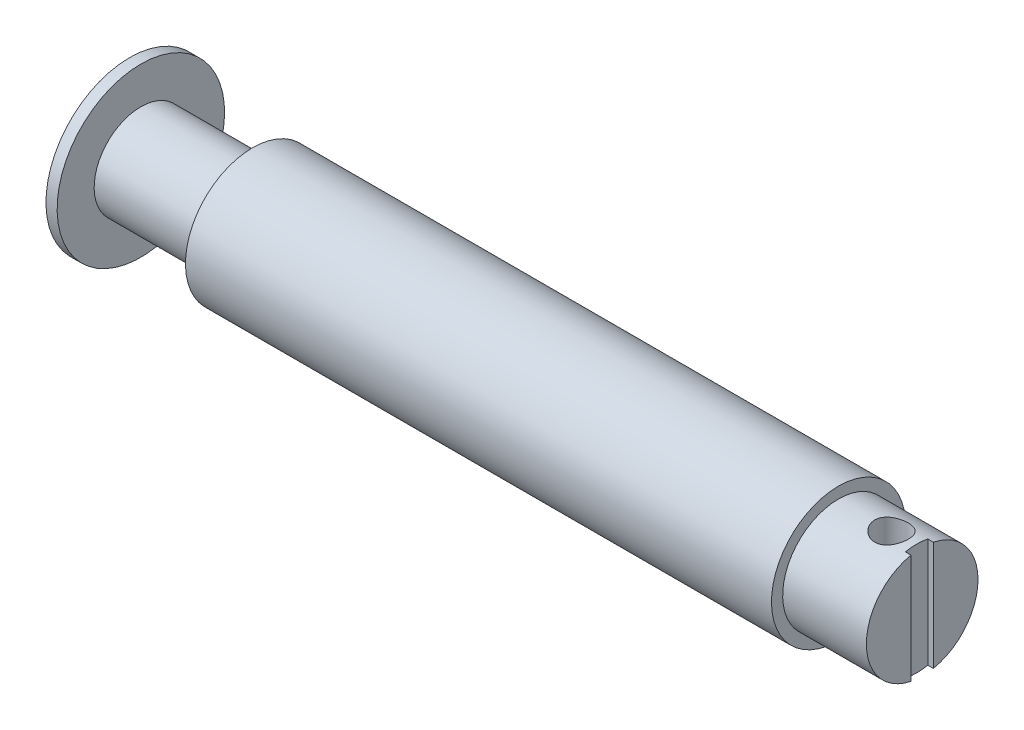
ISO-10303-21;
HEADER;
FILE_DESCRIPTION(('STEP AP214'),'2;1');
FILE_NAME('part.step','',(''),(''),'','','');
FILE_SCHEMA(('AUTOMOTIVE_DESIGN { 1 0 10303 214 1 1 1 1 }'));
ENDSEC;
DATA;
#1=APPLICATION_CONTEXT('core data for automotive mechanical design processes');
#2=APPLICATION_PROTOCOL_DEFINITION('international standard','automotive_design',2000,#1);
#3=PRODUCT_CONTEXT('',#1,'mechanical');
#4=PRODUCT('Part','Part','',(#3));
#5=PRODUCT_RELATED_PRODUCT_CATEGORY('part','',(#4));
#6=PRODUCT_DEFINITION_FORMATION('','',#4);
#7=PRODUCT_DEFINITION_CONTEXT('part definition',#1,'design');
#8=PRODUCT_DEFINITION('design','',#6,#7);
#9=PRODUCT_DEFINITION_SHAPE('','',#8);
#10=(LENGTH_UNIT() NAMED_UNIT(*) SI_UNIT(.MILLI.,.METRE.));
#11=(NAMED_UNIT(*) PLANE_ANGLE_UNIT() SI_UNIT($,.RADIAN.));
#12=(NAMED_UNIT(*) SI_UNIT($,.STERADIAN.) SOLID_ANGLE_UNIT());
#13=UNCERTAINTY_MEASURE_WITH_UNIT(LENGTH_MEASURE(1.E-05),#10,'distance_accuracy_value','');
#14=(GEOMETRIC_REPRESENTATION_CONTEXT(3) GLOBAL_UNCERTAINTY_ASSIGNED_CONTEXT((#13)) GLOBAL_UNIT_ASSIGNED_CONTEXT((#10,
#11,#12)) REPRESENTATION_CONTEXT('',''));
#15=CARTESIAN_POINT('',(0.,0.,0.));
#16=DIRECTION('',(0.,0.,1.));
#17=DIRECTION('',(1.,0.,0.));
#18=AXIS2_PLACEMENT_3D('',#15,#16,#17);
#19=CARTESIAN_POINT('',(87.,2.70021046205131E-13,0.));
#20=DIRECTION('',(1.,0.,0.));
#21=DIRECTION('',(0.,1.,0.));
#22=AXIS2_PLACEMENT_3D('',#19,#20,#21);
#23=PLANE('',#22);
#24=CARTESIAN_POINT('',(87.,2.70021046205131E-13,0.));
#25=DIRECTION('',(1.,0.,0.));
#26=DIRECTION('',(0.,1.,0.));
#27=AXIS2_PLACEMENT_3D('',#24,#25,#26);
#28=CIRCLE('',#27,9.99999999999867);
#29=CARTESIAN_POINT('',(87.,9.79795897113149,-2.));
#30=VERTEX_POINT('',#29);
#31=CARTESIAN_POINT('',(87.,9.79795897113149,2.));
#32=VERTEX_POINT('',#31);
#33=EDGE_CURVE('E103',#30,#32,#28,.T.);
#34=ORIENTED_EDGE('',*,*,#33,.T.);
#35=DIRECTION('',(0.,1.,0.));
#36=VECTOR('',#35,1.);
#37=CARTESIAN_POINT('',(87.,9.79795897113149,2.));
#38=LINE('',#37,#36);
#39=CARTESIAN_POINT('',(87.,-9.79795897113109,2.));
#40=VERTEX_POINT('',#39);
#41=EDGE_CURVE('E87',#40,#32,#38,.T.);
#42=ORIENTED_EDGE('',*,*,#41,.F.);
#43=CARTESIAN_POINT('',(87.,-9.79795897113122,-2.));
#44=VERTEX_POINT('',#43);
#45=EDGE_CURVE('E109',#40,#44,#28,.T.);
#46=ORIENTED_EDGE('',*,*,#45,.T.);
#47=DIRECTION('',(0.,1.,0.));
#48=VECTOR('',#47,1.);
#49=CARTESIAN_POINT('',(87.,-9.79795897113122,-2.));
#50=LINE('',#49,#48);
#51=EDGE_CURVE('E108',#44,#30,#50,.T.);
#52=ORIENTED_EDGE('',*,*,#51,.T.);
#53=EDGE_LOOP('',(#34,#42,#46,#52));
#54=FACE_BOUND('',#53,.T.);
#55=ADVANCED_FACE('F43',(#54),#23,.T.);
#56=CARTESIAN_POINT('',(73.,2.70616862252382E-13,0.));
#57=DIRECTION('',(1.,0.,0.));
#58=DIRECTION('',(0.,1.,0.));
#59=AXIS2_PLACEMENT_3D('',#56,#57,#58);
#60=PLANE('',#59);
#61=CARTESIAN_POINT('',(73.,2.70616862252382E-13,0.));
#62=DIRECTION('',(1.,0.,0.));
#63=DIRECTION('',(0.,1.,0.));
#64=AXIS2_PLACEMENT_3D('',#61,#62,#63);
#65=CIRCLE('',#64,12.);
#66=CARTESIAN_POINT('',(73.,12.0000000000003,0.));
#67=VERTEX_POINT('',#66);
#68=EDGE_CURVE('E138',#67,#67,#65,.T.);
#69=ORIENTED_EDGE('',*,*,#68,.T.);
#70=EDGE_LOOP('',(#69));
#71=FACE_BOUND('',#70,.T.);
#72=CARTESIAN_POINT('',(73.,2.70025701018E-13,0.));
#73=DIRECTION('',(1.,0.,0.));
#74=DIRECTION('',(0.,1.,0.));
#75=AXIS2_PLACEMENT_3D('',#72,#73,#74);
#76=CIRCLE('',#75,10.);
#77=CARTESIAN_POINT('',(73.,10.0000000000003,0.));
#78=VERTEX_POINT('',#77);
#79=EDGE_CURVE('E118',#78,#78,#76,.T.);
#80=ORIENTED_EDGE('',*,*,#79,.F.);
#81=EDGE_LOOP('',(#80));
#82=FACE_BOUND('',#81,.T.);
#83=ADVANCED_FACE('F167',(#71,#82),#60,.T.);
#84=CARTESIAN_POINT('',(-54.,2.70025701018E-13,0.));
#85=DIRECTION('',(1.,0.,0.));
#86=DIRECTION('',(0.,1.,0.));
#87=AXIS2_PLACEMENT_3D('',#84,#85,#86);
#88=CYLINDRICAL_SURFACE('',#87,15.);
#89=CARTESIAN_POINT('',(-54.,2.70025701018E-13,0.));
#90=DIRECTION('',(1.,0.,0.));
#91=DIRECTION('',(0.,1.,0.));
#92=AXIS2_PLACEMENT_3D('',#89,#90,#91);
#93=CIRCLE('',#92,15.);
#94=CARTESIAN_POINT('',(-54.,15.0000000000003,0.));
#95=VERTEX_POINT('',#94);
#96=EDGE_CURVE('E144',#95,#95,#93,.T.);
#97=ORIENTED_EDGE('',*,*,#96,.T.);
#98=EDGE_LOOP('',(#97));
#99=FACE_BOUND('',#98,.T.);
#100=CARTESIAN_POINT('',(-52.,2.70035010643738E-13,0.));
#101=DIRECTION('',(1.,0.,0.));
#102=DIRECTION('',(0.,1.,0.));
#103=AXIS2_PLACEMENT_3D('',#100,#101,#102);
#104=CIRCLE('',#103,15.);
#105=CARTESIAN_POINT('',(-52.,15.0000000000003,0.));
#106=VERTEX_POINT('',#105);
#107=EDGE_CURVE('E125',#106,#106,#104,.T.);
#108=ORIENTED_EDGE('',*,*,#107,.F.);
#109=EDGE_LOOP('',(#108));
#110=FACE_BOUND('',#109,.T.);
#111=ADVANCED_FACE('F45',(#99,#110),#88,.T.);
#112=CARTESIAN_POINT('',(-54.,15.0000000000003,0.));
#113=DIRECTION('',(-1.,0.,0.));
#114=DIRECTION('',(0.,-1.,0.));
#115=AXIS2_PLACEMENT_3D('',#112,#113,#114);
#116=PLANE('',#115);
#117=ORIENTED_EDGE('',*,*,#96,.F.);
#118=EDGE_LOOP('',(#117));
#119=FACE_BOUND('',#118,.T.);
#120=ADVANCED_FACE('F202',(#119),#116,.T.);
#121=CARTESIAN_POINT('',(-54.,2.70025701018E-13,0.));
#122=DIRECTION('',(1.,0.,0.));
#123=DIRECTION('',(0.,1.,0.));
#124=AXIS2_PLACEMENT_3D('',#121,#122,#123);
#125=CYLINDRICAL_SURFACE('',#124,12.);
#126=CARTESIAN_POINT('',(-32.,2.70128106901121E-13,0.));
#127=DIRECTION('',(1.,0.,0.));
#128=DIRECTION('',(0.,1.,0.));
#129=AXIS2_PLACEMENT_3D('',#126,#127,#128);
#130=CIRCLE('',#129,12.);
#131=CARTESIAN_POINT('',(-32.,12.0000000000003,0.));
#132=VERTEX_POINT('',#131);
#133=EDGE_CURVE('E133',#132,#132,#130,.T.);
#134=ORIENTED_EDGE('',*,*,#133,.T.);
#135=EDGE_LOOP('',(#134));
#136=FACE_BOUND('',#135,.T.);
#137=ORIENTED_EDGE('',*,*,#68,.F.);
#138=EDGE_LOOP('',(#137));
#139=FACE_BOUND('',#138,.T.);
#140=ADVANCED_FACE('F198',(#136,#139),#125,.T.);
#141=CARTESIAN_POINT('',(-32.,12.0000000000003,0.));
#142=DIRECTION('',(-1.,0.,0.));
#143=DIRECTION('',(0.,-1.,0.));
#144=AXIS2_PLACEMENT_3D('',#141,#142,#143);
#145=PLANE('',#144);
#146=CARTESIAN_POINT('',(-32.,2.70128106901121E-13,0.));
#147=DIRECTION('',(1.,0.,0.));
#148=DIRECTION('',(0.,1.,0.));
#149=AXIS2_PLACEMENT_3D('',#146,#147,#148);
#150=CIRCLE('',#149,8.36463737488);
#151=CARTESIAN_POINT('',(-32.,8.36463737488027,0.));
#152=VERTEX_POINT('',#151);
#153=EDGE_CURVE('E131',#152,#152,#150,.T.);
#154=ORIENTED_EDGE('',*,*,#153,.T.);
#155=EDGE_LOOP('',(#154));
#156=FACE_BOUND('',#155,.T.);
#157=ORIENTED_EDGE('',*,*,#133,.F.);
#158=EDGE_LOOP('',(#157));
#159=FACE_BOUND('',#158,.T.);
#160=ADVANCED_FACE('F191',(#156,#159),#145,.T.);
#161=CARTESIAN_POINT('',(-54.,2.70025701018E-13,0.));
#162=DIRECTION('',(1.,0.,0.));
#163=DIRECTION('',(0.,1.,0.));
#164=AXIS2_PLACEMENT_3D('',#161,#162,#163);
#165=CYLINDRICAL_SURFACE('',#164,8.36463737488);
#166=CARTESIAN_POINT('',(-52.,2.70035010643738E-13,0.));
#167=DIRECTION('',(1.,0.,0.));
#168=DIRECTION('',(0.,1.,0.));
#169=AXIS2_PLACEMENT_3D('',#166,#167,#168);
#170=CIRCLE('',#169,8.36463737488);
#171=CARTESIAN_POINT('',(-52.,8.36463737488027,0.));
#172=VERTEX_POINT('',#171);
#173=EDGE_CURVE('E128',#172,#172,#170,.T.);
#174=ORIENTED_EDGE('',*,*,#173,.T.);
#175=EDGE_LOOP('',(#174));
#176=FACE_BOUND('',#175,.T.);
#177=ORIENTED_EDGE('',*,*,#153,.F.);
#178=EDGE_LOOP('',(#177));
#179=FACE_BOUND('',#178,.T.);
#180=ADVANCED_FACE('F182',(#176,#179),#165,.T.);
#181=CARTESIAN_POINT('',(-52.,8.36463737488027,0.));
#182=DIRECTION('',(1.,0.,0.));
#183=DIRECTION('',(0.,1.,0.));
#184=AXIS2_PLACEMENT_3D('',#181,#182,#183);
#185=PLANE('',#184);
#186=ORIENTED_EDGE('',*,*,#107,.T.);
#187=EDGE_LOOP('',(#186));
#188=FACE_BOUND('',#187,.T.);
#189=ORIENTED_EDGE('',*,*,#173,.F.);
#190=EDGE_LOOP('',(#189));
#191=FACE_BOUND('',#190,.T.);
#192=ADVANCED_FACE('F175',(#188,#191),#185,.T.);
#193=CARTESIAN_POINT('',(88.,2.70095523211037E-13,0.));
#194=DIRECTION('',(-1.,0.,0.));
#195=DIRECTION('',(0.,-1.,0.));
#196=AXIS2_PLACEMENT_3D('',#193,#194,#195);
#197=CYLINDRICAL_SURFACE('',#196,10.);
#198=CARTESIAN_POINT('',(85.5,-9.99999999999973,0.));
#199=CARTESIAN_POINT('',(85.4999980050302,-9.99999858501073,-0.164577225506601));
#200=CARTESIAN_POINT('',(85.4864122727521,-9.9958983138788,-0.32917463670306));
#201=CARTESIAN_POINT('',(85.4325572915558,-9.97994211187355,-0.653576250609763));
#202=CARTESIAN_POINT('',(85.3922800839533,-9.96808386779357,-0.813379008822841));
#203=CARTESIAN_POINT('',(85.2865079661795,-9.93791105003646,-1.12346541550905));
#204=CARTESIAN_POINT('',(85.2210502607621,-9.91960600500824,-1.27376272879075));
#205=CARTESIAN_POINT('',(85.0669278138883,-9.87844218475263,-1.56124836210626));
#206=CARTESIAN_POINT('',(84.9782599852092,-9.85558280384106,-1.69843493493934));
#207=CARTESIAN_POINT('',(84.7775519850547,-9.80701474385521,-1.95974359436749));
#208=CARTESIAN_POINT('',(84.6649667482282,-9.78124767314045,-2.08343614248869));
#209=CARTESIAN_POINT('',(84.4207815401796,-9.73011668420857,-2.31049841846648));
#210=CARTESIAN_POINT('',(84.2891783757501,-9.70475283448976,-2.41386472654882));
#211=CARTESIAN_POINT('',(84.0070584939248,-9.65668227987517,-2.59960075447415));
#212=CARTESIAN_POINT('',(83.8561830780185,-9.63404813327722,-2.68144618044427));
#213=CARTESIAN_POINT('',(83.5420214915394,-9.59487240788035,-2.81842789549521));
#214=CARTESIAN_POINT('',(83.3787383121441,-9.57832936626594,-2.87357059839947));
#215=CARTESIAN_POINT('',(83.0492194677391,-9.55381741676841,-2.95403267365303));
#216=CARTESIAN_POINT('',(82.8831945122721,-9.5456213864904,-2.98014392469355));
#217=CARTESIAN_POINT('',(82.5489336875665,-9.53805579499507,-3.00427461229344));
#218=CARTESIAN_POINT('',(82.3806983638818,-9.53868409521115,-3.00230085522157));
#219=CARTESIAN_POINT('',(82.053232182783,-9.54849488135528,-2.97093954399624));
#220=CARTESIAN_POINT('',(81.8938954992755,-9.55736777198254,-2.94254410525371));
#221=CARTESIAN_POINT('',(81.5823604274531,-9.58216712457221,-2.86074840854112));
#222=CARTESIAN_POINT('',(81.4301627452513,-9.59809428264674,-2.80734568283282));
#223=CARTESIAN_POINT('',(81.1347993006785,-9.63545466149919,-2.67632053307363));
#224=CARTESIAN_POINT('',(80.9917858320895,-9.65696032231877,-2.59837633869285));
#225=CARTESIAN_POINT('',(80.7205359559796,-9.70301974000102,-2.42070445177366));
#226=CARTESIAN_POINT('',(80.5923031411724,-9.72757423493955,-2.32097148005177));
#227=CARTESIAN_POINT('',(80.348627618476,-9.77822022595847,-2.09762581531093));
#228=CARTESIAN_POINT('',(80.2339426719407,-9.80433308620969,-1.97318981493395));
#229=CARTESIAN_POINT('',(80.0268920318715,-9.8542448812649,-1.70652651862793));
#230=CARTESIAN_POINT('',(79.9345277431711,-9.87804367036793,-1.56429810372178));
#231=CARTESIAN_POINT('',(79.7742801550705,-9.92086320138914,-1.26471007668561));
#232=CARTESIAN_POINT('',(79.7065649675003,-9.93985087336601,-1.1072554994959));
#233=CARTESIAN_POINT('',(79.5988008198007,-9.97067043664417,-0.782490831207036));
#234=CARTESIAN_POINT('',(79.558744142935,-9.98250432373972,-0.61518350317916));
#235=CARTESIAN_POINT('',(79.5086956442012,-9.9973672928705,-0.281904485336659));
#236=CARTESIAN_POINT('',(79.4976768283968,-10.0006970083555,-0.11610019520237));
#237=CARTESIAN_POINT('',(79.5031383114242,-9.99905846483492,0.214999211646771));
#238=CARTESIAN_POINT('',(79.5196149393029,-9.99409131355487,0.380294393381567));
#239=CARTESIAN_POINT('',(79.578769222223,-9.97661393974298,0.701807210619399));
#240=CARTESIAN_POINT('',(79.6208467751618,-9.96427659598801,0.858145545228343));
#241=CARTESIAN_POINT('',(79.7292864655564,-9.93348695683043,1.16150927790905));
#242=CARTESIAN_POINT('',(79.7956515220757,-9.91503392642161,1.30853355405117));
#243=CARTESIAN_POINT('',(79.9525063309623,-9.87339308702604,1.59287437892211));
#244=CARTESIAN_POINT('',(80.043518681896,-9.85010561659253,1.72988765239934));
#245=CARTESIAN_POINT('',(80.2464495081056,-9.80146937528677,1.9870466159603));
#246=CARTESIAN_POINT('',(80.3583732237753,-9.77612008862392,2.10718806471189));
#247=CARTESIAN_POINT('',(80.6047746167387,-9.72506343737979,2.33171489102053));
#248=CARTESIAN_POINT('',(80.7399237515437,-9.69937650065486,2.43536962463002));
#249=CARTESIAN_POINT('',(81.0262558780269,-9.65153030477922,2.61857990144313));
#250=CARTESIAN_POINT('',(81.1774384491158,-9.62937095313094,2.69813607658965));
#251=CARTESIAN_POINT('',(81.4910649825101,-9.59134379226282,2.83034694254316));
#252=CARTESIAN_POINT('',(81.6534523730757,-9.57544675673473,2.88312693874022));
#253=CARTESIAN_POINT('',(81.9853759378605,-9.55183188739709,2.96043461630307));
#254=CARTESIAN_POINT('',(82.1549096415661,-9.5441112506936,2.98497197957849));
#255=CARTESIAN_POINT('',(82.4887230367768,-9.53799944941531,3.0044396896993));
#256=CARTESIAN_POINT('',(82.6529273020988,-9.53923294700367,3.00056110615887));
#257=CARTESIAN_POINT('',(82.9782282068012,-9.54998802392161,2.9661501088861));
#258=CARTESIAN_POINT('',(83.139324970361,-9.55950927135875,2.93561876249408));
#259=CARTESIAN_POINT('',(83.4518907982634,-9.58551527389216,2.84953777608686));
#260=CARTESIAN_POINT('',(83.6034545747174,-9.60191209104907,2.79430351014248));
#261=CARTESIAN_POINT('',(83.8952848776414,-9.63980557805238,2.66063014242148));
#262=CARTESIAN_POINT('',(84.0355492352832,-9.66130322385053,2.58218659925723));
#263=CARTESIAN_POINT('',(84.3063262330525,-9.70795352855311,2.40097527610176));
#264=CARTESIAN_POINT('',(84.4362975225204,-9.73321080328553,2.29742552185996));
#265=CARTESIAN_POINT('',(84.6774049966162,-9.78402640899039,2.07034869259554));
#266=CARTESIAN_POINT('',(84.7885362789357,-9.80958481647516,1.94681643426897));
#267=CARTESIAN_POINT('',(84.9920468245899,-9.85901873141546,1.67893152436651));
#268=CARTESIAN_POINT('',(85.083782893711,-9.88282319531395,1.53407577158121));
#269=CARTESIAN_POINT('',(85.2414703398081,-9.92521360911526,1.23028274796705));
#270=CARTESIAN_POINT('',(85.307433776549,-9.94380199862087,1.0713521059979));
#271=CARTESIAN_POINT('',(85.4057905513055,-9.97204349938592,0.761515425310564));
#272=CARTESIAN_POINT('',(85.4410233457665,-9.98244054762113,0.61157392390847));
#273=CARTESIAN_POINT('',(85.4881270504832,-9.99641888988953,0.30776039046156));
#274=CARTESIAN_POINT('',(85.5000018654097,-10.0000013230945,0.15388901971628));
#275=CARTESIAN_POINT('',(85.5,-9.99999999999973,0.));
#276=B_SPLINE_CURVE_WITH_KNOTS('',3,(#198,#199,#200,#201,#202,#203,#204,#205,#206,#207,#208,
#209,#210,#211,#212,#213,#214,#215,#216,#217,#218,#219,#220,#221,#222,#223,#224,#225,#226,#227,
#228,#229,#230,#231,#232,#233,#234,#235,#236,#237,#238,#239,#240,#241,#242,#243,#244,#245,#246,
#247,#248,#249,#250,#251,#252,#253,#254,#255,#256,#257,#258,#259,#260,#261,#262,#263,#264,#265,
#266,#267,#268,#269,#270,#271,#272,#273,#274,#275),.UNSPECIFIED.,.T.,.F.,(4,2,2,2,2,2,2,2,2,2,2,
2,2,2,2,2,2,2,2,2,2,2,2,2,2,2,2,2,2,2,2,2,2,2,2,2,2,2,4),(0.,0.493166407225223,0.986479929692,
1.47906735260175,1.97172032882541,2.47711205896383,2.98258874577267,3.49942962008218,
4.01614629086448,4.51839378713199,5.02051956638179,5.50452033395353,5.98856887316004,
6.4792485289424,6.97004720317112,7.48134208096335,7.99266913062143,8.50742093763378,
9.02202907057617,9.51817618877091,10.0142570710065,10.4991349336466,10.9840710918746,
11.4802261140582,11.9765056400038,12.4908080064564,13.0050968850536,13.5169562990251,
14.0286401892057,14.5190031093854,15.0093463933232,15.4936008081456,15.9779479511534,
16.4799385136898,16.9820594980413,17.4988599232246,18.0154182319959,18.4766338387004,
18.9377723390687),.UNSPECIFIED.);
#277=CARTESIAN_POINT('',(85.5,-9.99999999999973,0.));
#278=VERTEX_POINT('',#277);
#279=EDGE_CURVE('E12',#278,#278,#276,.T.);
#280=ORIENTED_EDGE('',*,*,#279,.T.);
#281=EDGE_LOOP('',(#280));
#282=FACE_BOUND('',#281,.T.);
#283=CARTESIAN_POINT('',(82.5,9.53939201416973,3.));
#284=CARTESIAN_POINT('',(82.3356109041152,9.53939371453987,2.99999795267528));
#285=CARTESIAN_POINT('',(82.171201551712,9.54368780418165,2.98644216334285));
#286=CARTESIAN_POINT('',(81.8471895008161,9.56033156605827,2.93271688893499));
#287=CARTESIAN_POINT('',(81.6875884269971,9.57268392986963,2.89253851147156));
#288=CARTESIAN_POINT('',(81.3779305434565,9.60392204971292,2.78705506539911));
#289=CARTESIAN_POINT('',(81.2278583407338,9.62279693406492,2.72179178788487));
#290=CARTESIAN_POINT('',(80.9407561320094,9.66493865095161,2.56812843835858));
#291=CARTESIAN_POINT('',(80.8037280826311,9.68820614082066,2.47972490274106));
#292=CARTESIAN_POINT('',(80.5422672188453,9.73733724371558,2.27929508283254));
#293=CARTESIAN_POINT('',(80.4183082041074,9.76325616623298,2.16666414351613));
#294=CARTESIAN_POINT('',(80.190724097355,9.81429723873541,1.9222724751592));
#295=CARTESIAN_POINT('',(80.0871016191002,9.83941928595437,1.79050929092223));
#296=CARTESIAN_POINT('',(79.9010746003334,9.88666429158805,1.50822287558738));
#297=CARTESIAN_POINT('',(79.8191531511144,9.90871448684835,1.35736804267163));
#298=CARTESIAN_POINT('',(79.6820254819145,9.94668871841396,1.04324929073871));
#299=CARTESIAN_POINT('',(79.6268135002851,9.96261407579019,0.879988056775823));
#300=CARTESIAN_POINT('',(79.546239997819,9.98615292007205,0.550647705261658));
#301=CARTESIAN_POINT('',(79.5200697446946,9.99399114738701,0.384782797907602));
#302=CARTESIAN_POINT('',(79.4957653507071,10.0012640300273,0.0508436474986256));
#303=CARTESIAN_POINT('',(79.4976253211961,10.000700450422,-0.117230124100745));
#304=CARTESIAN_POINT('',(79.528785737086,9.99139207635332,-0.445142313200317));
#305=CARTESIAN_POINT('',(79.5572103876197,9.98290840410502,-0.605072535282663));
#306=CARTESIAN_POINT('',(79.6392626719886,9.95903044225258,-0.917778426885078));
#307=CARTESIAN_POINT('',(79.6928919018855,9.94363571501367,-1.07055364264578));
#308=CARTESIAN_POINT('',(79.824424046837,9.90730441973783,-1.36669465270248));
#309=CARTESIAN_POINT('',(79.9026024056139,9.88630539352799,-1.50993012938864));
#310=CARTESIAN_POINT('',(80.080795704857,9.84099281296805,-1.78152934756663));
#311=CARTESIAN_POINT('',(80.1808158259292,9.8166784727797,-1.90988954974545));
#312=CARTESIAN_POINT('',(80.4043955015009,9.76623100973879,-2.15332096305837));
#313=CARTESIAN_POINT('',(80.5287138380508,9.7400639063353,-2.26768916079756));
#314=CARTESIAN_POINT('',(80.7950200357888,9.68967959784441,-2.47415303080115));
#315=CARTESIAN_POINT('',(80.937009650811,9.66546258669269,-2.56624648967452));
#316=CARTESIAN_POINT('',(81.2364789384722,9.6215580635974,-2.72627990669511));
#317=CARTESIAN_POINT('',(81.3940940916175,9.60191621258518,-2.79397978469378));
#318=CARTESIAN_POINT('',(81.7192144167786,9.56992784963817,-2.9016672575074));
#319=CARTESIAN_POINT('',(81.8867163430351,9.55757895796666,-2.94166389279495));
#320=CARTESIAN_POINT('',(82.2201647215024,9.54209699116266,-2.99149540565762));
#321=CARTESIAN_POINT('',(82.3859364477944,9.53863757349944,-3.00239892760807));
#322=CARTESIAN_POINT('',(82.7169458000133,9.54042384874839,-2.99671894465741));
#323=CARTESIAN_POINT('',(82.88218349746,9.54566832310814,-2.98013928742559));
#324=CARTESIAN_POINT('',(83.2029767559434,9.56395117112181,-2.92091527148479));
#325=CARTESIAN_POINT('',(83.3586723285275,9.57678353015629,-2.87895922862587));
#326=CARTESIAN_POINT('',(83.6608033816294,9.60858282461857,-2.77097155495854));
#327=CARTESIAN_POINT('',(83.807237428281,9.62755070718004,-2.70493620685512));
#328=CARTESIAN_POINT('',(84.0910349281444,9.67011670046295,-2.54863742393009));
#329=CARTESIAN_POINT('',(84.2280494419716,9.69382542139671,-2.4577712834546));
#330=CARTESIAN_POINT('',(84.4852762123616,9.74296411293955,-2.25510603200767));
#331=CARTESIAN_POINT('',(84.6054844352256,9.76839449460021,-2.14330191069793));
#332=CARTESIAN_POINT('',(84.8303608116295,9.81927267096357,-1.89691026498721));
#333=CARTESIAN_POINT('',(84.934271257974,9.84468490126038,-1.76162213171487));
#334=CARTESIAN_POINT('',(85.1179334020555,9.89169703497325,-1.4749235691805));
#335=CARTESIAN_POINT('',(85.1976862995629,9.9132971276946,-1.32351394108789));
#336=CARTESIAN_POINT('',(85.3300000611366,9.95011940949942,-1.00987100941044));
#337=CARTESIAN_POINT('',(85.382764032318,9.96538906849959,-0.847729244075678));
#338=CARTESIAN_POINT('',(85.4601218377808,9.9880395919368,-0.516339933009174));
#339=CARTESIAN_POINT('',(85.4847237318968,9.99542271341787,-0.347094434709523));
#340=CARTESIAN_POINT('',(85.504446088109,10.0013308816283,-0.0133043077654835));
#341=CARTESIAN_POINT('',(85.5006653908157,10.0001861022267,0.151170358172415));
#342=CARTESIAN_POINT('',(85.4663567350018,9.989945289301,0.47703896232881));
#343=CARTESIAN_POINT('',(85.4358302930391,9.98084970660952,0.638433074693058));
#344=CARTESIAN_POINT('',(85.3495766772007,9.9558233671668,0.951871626082716));
#345=CARTESIAN_POINT('',(85.294123638702,9.93996705801758,1.10399785470278));
#346=CARTESIAN_POINT('',(85.1598361709856,9.90305886078927,1.39686647550411));
#347=CARTESIAN_POINT('',(85.0809978994276,9.88200611899919,1.53760699210116));
#348=CARTESIAN_POINT('',(84.8992530851399,9.83607931656484,1.80860378484113));
#349=CARTESIAN_POINT('',(84.7956571399985,9.81110453847146,1.93838050015354));
#350=CARTESIAN_POINT('',(84.5685792233344,9.76047074424695,2.17907514269189));
#351=CARTESIAN_POINT('',(84.4450915242037,9.73481153282185,2.28998761920388));
#352=CARTESIAN_POINT('',(84.177318443379,9.68481361262665,2.49312538789098));
#353=CARTESIAN_POINT('',(84.0325228932191,9.66053705386997,2.58469519515913));
#354=CARTESIAN_POINT('',(83.728889651678,9.61705095017613,2.74208627057552));
#355=CARTESIAN_POINT('',(83.5700587527976,9.59783897193938,2.80791991114577));
#356=CARTESIAN_POINT('',(83.2605191367875,9.56855633435216,2.90603885065899));
#357=CARTESIAN_POINT('',(83.110782706138,9.55772309681067,2.94117718022463));
#358=CARTESIAN_POINT('',(82.8073695550085,9.5431408519436,2.98815637670288));
#359=CARTESIAN_POINT('',(82.6536936307095,9.53939042442888,3.00000191412191));
#360=CARTESIAN_POINT('',(82.5,9.53939201416973,3.));
#361=B_SPLINE_CURVE_WITH_KNOTS('',3,(#283,#284,#285,#286,#287,#288,#289,#290,#291,#292,#293,
#294,#295,#296,#297,#298,#299,#300,#301,#302,#303,#304,#305,#306,#307,#308,#309,#310,#311,#312,
#313,#314,#315,#316,#317,#318,#319,#320,#321,#322,#323,#324,#325,#326,#327,#328,#329,#330,#331,
#332,#333,#334,#335,#336,#337,#338,#339,#340,#341,#342,#343,#344,#345,#346,#347,#348,#349,#350,
#351,#352,#353,#354,#355,#356,#357,#358,#359,#360),.UNSPECIFIED.,.T.,.F.,(4,2,2,2,2,2,2,2,2,2,2,
2,2,2,2,2,2,2,2,2,2,2,2,2,2,2,2,2,2,2,2,2,2,2,2,2,2,2,4),(0.,0.492600331831084,
0.985365283378001,1.4773128289324,1.96933405074019,2.47546300015968,2.98165695742546,
3.49831878547289,4.01486911175754,4.51664280299116,5.01831108202881,5.50400251981761,
5.98972471780753,6.48110418671353,6.97260033181662,7.48304294046557,7.99353624983727,
8.50892476494934,9.02414501262033,9.52016161585829,10.0161087821999,10.4991718988284,
10.9823096209678,11.4784146362399,11.9746385186306,12.4895901220641,13.0045161465361,
13.5155078363386,14.0263532464858,14.5175260782765,15.0086710610072,15.4945419374965,
15.9804926898797,16.4819925411419,16.9836370526499,17.5002327934351,18.016579879331,
18.4772230772011,18.9377739007233),.UNSPECIFIED.);
#362=CARTESIAN_POINT('',(82.5,9.53939201416973,3.));
#363=VERTEX_POINT('',#362);
#364=EDGE_CURVE('E55',#363,#363,#361,.T.);
#365=ORIENTED_EDGE('',*,*,#364,.T.);
#366=EDGE_LOOP('',(#365));
#367=FACE_BOUND('',#366,.T.);
#368=CARTESIAN_POINT('',(88.,2.70095523211037E-13,0.));
#369=DIRECTION('',(1.,0.,0.));
#370=DIRECTION('',(0.,1.,0.));
#371=AXIS2_PLACEMENT_3D('',#368,#369,#370);
#372=CIRCLE('',#371,10.);
#373=CARTESIAN_POINT('',(88.,-9.79795897113244,-2.));
#374=VERTEX_POINT('',#373);
#375=CARTESIAN_POINT('',(88.,9.79795897113149,-2.));
#376=VERTEX_POINT('',#375);
#377=EDGE_CURVE('E122',#374,#376,#372,.T.);
#378=ORIENTED_EDGE('',*,*,#377,.F.);
#379=DIRECTION('',(1.,0.,0.));
#380=VECTOR('',#379,1.);
#381=CARTESIAN_POINT('',(87.,-9.79795897113122,-2.));
#382=LINE('',#381,#380);
#383=EDGE_CURVE('E70',#44,#374,#382,.T.);
#384=ORIENTED_EDGE('',*,*,#383,.F.);
#385=ORIENTED_EDGE('',*,*,#45,.F.);
#386=DIRECTION('',(-1.,0.,0.));
#387=VECTOR('',#386,1.);
#388=CARTESIAN_POINT('',(88.,-9.79795897113122,2.));
#389=LINE('',#388,#387);
#390=CARTESIAN_POINT('',(88.,-9.79795897113122,2.));
#391=VERTEX_POINT('',#390);
#392=EDGE_CURVE('E62',#391,#40,#389,.T.);
#393=ORIENTED_EDGE('',*,*,#392,.F.);
#394=CARTESIAN_POINT('',(88.,2.70030355830869E-13,0.));
#395=DIRECTION('',(1.,0.,0.));
#396=DIRECTION('',(0.,-1.,0.));
#397=AXIS2_PLACEMENT_3D('',#394,#395,#396);
#398=CIRCLE('',#397,9.99999999999867);
#399=CARTESIAN_POINT('',(88.,9.79795897113149,2.));
#400=VERTEX_POINT('',#399);
#401=EDGE_CURVE('E95',#400,#391,#398,.T.);
#402=ORIENTED_EDGE('',*,*,#401,.F.);
#403=DIRECTION('',(-1.,0.,0.));
#404=VECTOR('',#403,1.);
#405=CARTESIAN_POINT('',(88.,9.79795897113149,2.));
#406=LINE('',#405,#404);
#407=EDGE_CURVE('E90',#400,#32,#406,.T.);
#408=ORIENTED_EDGE('',*,*,#407,.T.);
#409=ORIENTED_EDGE('',*,*,#33,.F.);
#410=DIRECTION('',(1.,0.,0.));
#411=VECTOR('',#410,1.);
#412=CARTESIAN_POINT('',(87.,9.79795897113149,-2.));
#413=LINE('',#412,#411);
#414=EDGE_CURVE('E116',#30,#376,#413,.T.);
#415=ORIENTED_EDGE('',*,*,#414,.T.);
#416=EDGE_LOOP('',(#378,#384,#385,#393,#402,#408,#409,#415));
#417=FACE_BOUND('',#416,.T.);
#418=ORIENTED_EDGE('',*,*,#79,.T.);
#419=EDGE_LOOP('',(#418));
#420=FACE_BOUND('',#419,.T.);
#421=ADVANCED_FACE('F100',(#282,#367,#417,#420),#197,.T.);
#422=CARTESIAN_POINT('',(88.,2.70095523211037E-13,0.));
#423=DIRECTION('',(1.,0.,0.));
#424=DIRECTION('',(0.,1.,0.));
#425=AXIS2_PLACEMENT_3D('',#422,#423,#424);
#426=PLANE('',#425);
#427=DIRECTION('',(0.,1.,0.));
#428=VECTOR('',#427,1.);
#429=CARTESIAN_POINT('',(88.,-9.79795897113122,-2.));
#430=LINE('',#429,#428);
#431=EDGE_CURVE('E112',#374,#376,#430,.T.);
#432=ORIENTED_EDGE('',*,*,#431,.F.);
#433=ORIENTED_EDGE('',*,*,#377,.T.);
#434=EDGE_LOOP('',(#432,#433));
#435=FACE_BOUND('',#434,.T.);
#436=ADVANCED_FACE('F169',(#435),#426,.T.);
#437=CARTESIAN_POINT('',(87.,-9.79795897113122,-2.));
#438=DIRECTION('',(0.,0.,-1.));
#439=DIRECTION('',(-1.,0.,0.));
#440=AXIS2_PLACEMENT_3D('',#437,#438,#439);
#441=PLANE('',#440);
#442=ORIENTED_EDGE('',*,*,#431,.T.);
#443=ORIENTED_EDGE('',*,*,#414,.F.);
#444=ORIENTED_EDGE('',*,*,#51,.F.);
#445=ORIENTED_EDGE('',*,*,#383,.T.);
#446=EDGE_LOOP('',(#442,#443,#444,#445));
#447=FACE_BOUND('',#446,.T.);
#448=ADVANCED_FACE('F164',(#447),#441,.F.);
#449=CARTESIAN_POINT('',(88.,9.79795897113149,2.));
#450=DIRECTION('',(0.,0.,1.));
#451=DIRECTION('',(1.,0.,0.));
#452=AXIS2_PLACEMENT_3D('',#449,#450,#451);
#453=PLANE('',#452);
#454=ORIENTED_EDGE('',*,*,#41,.T.);
#455=ORIENTED_EDGE('',*,*,#407,.F.);
#456=DIRECTION('',(0.,1.,0.));
#457=VECTOR('',#456,1.);
#458=CARTESIAN_POINT('',(88.,9.79795897113149,2.));
#459=LINE('',#458,#457);
#460=EDGE_CURVE('E105',#391,#400,#459,.T.);
#461=ORIENTED_EDGE('',*,*,#460,.F.);
#462=ORIENTED_EDGE('',*,*,#392,.T.);
#463=EDGE_LOOP('',(#454,#455,#461,#462));
#464=FACE_BOUND('',#463,.T.);
#465=ADVANCED_FACE('F89',(#464),#453,.F.);
#466=CARTESIAN_POINT('',(88.,2.70030355830869E-13,0.));
#467=DIRECTION('',(-1.,0.,0.));
#468=DIRECTION('',(0.,-1.,0.));
#469=AXIS2_PLACEMENT_3D('',#466,#467,#468);
#470=PLANE('',#469);
#471=ORIENTED_EDGE('',*,*,#401,.T.);
#472=ORIENTED_EDGE('',*,*,#460,.T.);
#473=EDGE_LOOP('',(#471,#472));
#474=FACE_BOUND('',#473,.T.);
#475=ADVANCED_FACE('F156',(#474),#470,.F.);
#476=CARTESIAN_POINT('',(82.5,-9.99999999999976,0.));
#477=DIRECTION('',(0.,1.,0.));
#478=DIRECTION('',(0.,0.,1.));
#479=AXIS2_PLACEMENT_3D('',#476,#477,#478);
#480=CYLINDRICAL_SURFACE('',#479,3.);
#481=ORIENTED_EDGE('',*,*,#364,.F.);
#482=EDGE_LOOP('',(#481));
#483=FACE_BOUND('',#482,.T.);
#484=ORIENTED_EDGE('',*,*,#279,.F.);
#485=EDGE_LOOP('',(#484));
#486=FACE_BOUND('',#485,.T.);
#487=ADVANCED_FACE('F152',(#483,#486),#480,.F.);
#488=CLOSED_SHELL('',(#55,#83,#111,#120,#140,#160,#180,#192,#421,#436,#448,#465,#475,#487));
#489=MANIFOLD_SOLID_BREP('B2',#488);
#490=ADVANCED_BREP_SHAPE_REPRESENTATION('',(#18,#489),#14);
#491=SHAPE_DEFINITION_REPRESENTATION(#9,#490);
ENDSEC;
END-ISO-10303-21;
